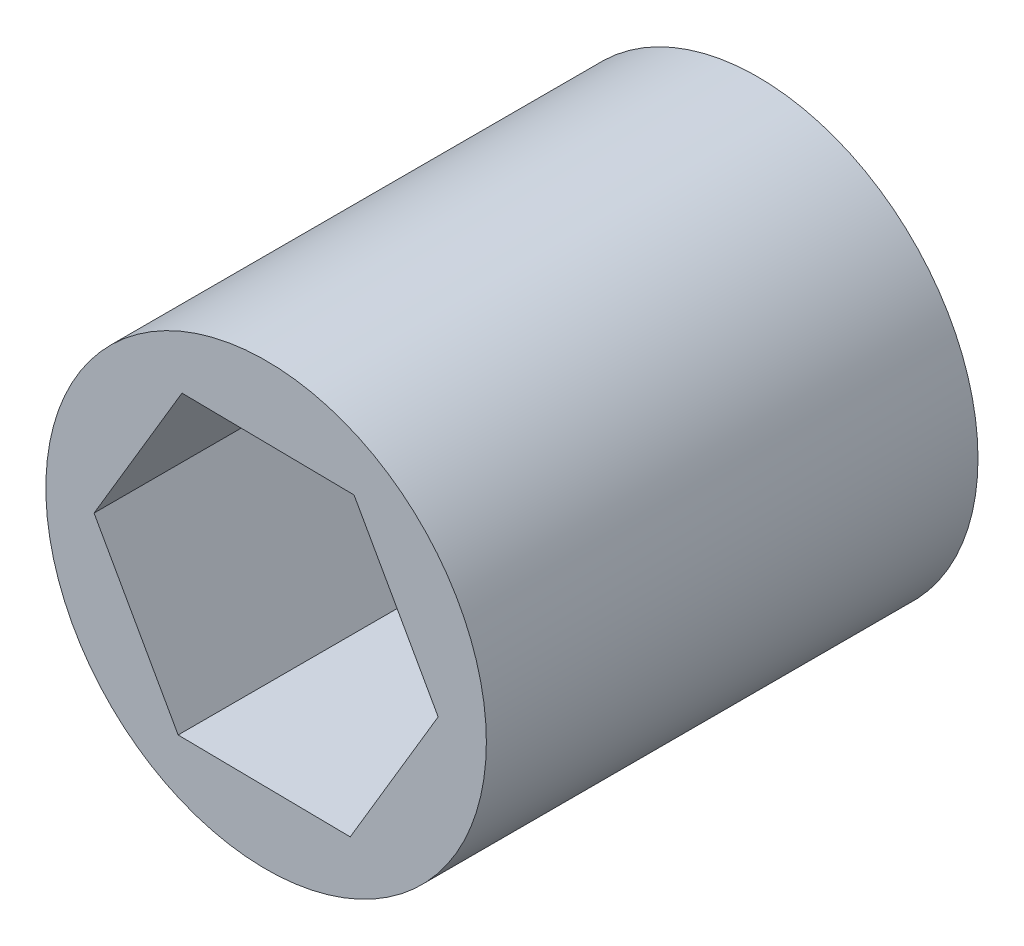
ISO-10303-21;
HEADER;
FILE_DESCRIPTION(('STEP AP214'),'2;1');
FILE_NAME('part.step','',(''),(''),'','','');
FILE_SCHEMA(('AUTOMOTIVE_DESIGN { 1 0 10303 214 1 1 1 1 }'));
ENDSEC;
DATA;
#1=APPLICATION_CONTEXT('core data for automotive mechanical design processes');
#2=APPLICATION_PROTOCOL_DEFINITION('international standard','automotive_design',2000,#1);
#3=PRODUCT_CONTEXT('',#1,'mechanical');
#4=PRODUCT('Part','Part','',(#3));
#5=PRODUCT_RELATED_PRODUCT_CATEGORY('part','',(#4));
#6=PRODUCT_DEFINITION_FORMATION('','',#4);
#7=PRODUCT_DEFINITION_CONTEXT('part definition',#1,'design');
#8=PRODUCT_DEFINITION('design','',#6,#7);
#9=PRODUCT_DEFINITION_SHAPE('','',#8);
#10=(LENGTH_UNIT() NAMED_UNIT(*) SI_UNIT(.MILLI.,.METRE.));
#11=(NAMED_UNIT(*) PLANE_ANGLE_UNIT() SI_UNIT($,.RADIAN.));
#12=(NAMED_UNIT(*) SI_UNIT($,.STERADIAN.) SOLID_ANGLE_UNIT());
#13=UNCERTAINTY_MEASURE_WITH_UNIT(LENGTH_MEASURE(1.E-05),#10,'distance_accuracy_value','');
#14=(GEOMETRIC_REPRESENTATION_CONTEXT(3) GLOBAL_UNCERTAINTY_ASSIGNED_CONTEXT((#13)) GLOBAL_UNIT_ASSIGNED_CONTEXT((#10,
#11,#12)) REPRESENTATION_CONTEXT('',''));
#15=CARTESIAN_POINT('',(0.,0.,0.));
#16=DIRECTION('',(0.,0.,1.));
#17=DIRECTION('',(1.,0.,0.));
#18=AXIS2_PLACEMENT_3D('',#15,#16,#17);
#19=CARTESIAN_POINT('',(0.,0.,20.));
#20=DIRECTION('',(0.,0.,1.));
#21=DIRECTION('',(1.,0.,0.));
#22=AXIS2_PLACEMENT_3D('',#19,#20,#21);
#23=PLANE('',#22);
#24=CARTESIAN_POINT('',(0.,0.,20.));
#25=DIRECTION('',(0.,0.,1.));
#26=DIRECTION('',(1.,0.,0.));
#27=AXIS2_PLACEMENT_3D('',#24,#25,#26);
#28=CIRCLE('',#27,8.9605185633105);
#29=CARTESIAN_POINT('',(8.9605185633105,0.,20.));
#30=VERTEX_POINT('',#29);
#31=EDGE_CURVE('E11',#30,#30,#28,.T.);
#32=ORIENTED_EDGE('',*,*,#31,.T.);
#33=EDGE_LOOP('',(#32));
#34=FACE_BOUND('',#33,.T.);
#35=DIRECTION('',(-0.511096833320989,-0.859523139286696,0.));
#36=VECTOR('',#35,1.);
#37=CARTESIAN_POINT('',(-3.42174319971634,6.10669087765174,20.));
#38=LINE('',#37,#36);
#39=CARTESIAN_POINT('',(-3.42174319971634,6.10669087765174,20.));
#40=VERTEX_POINT('',#39);
#41=CARTESIAN_POINT('',(-6.99942103296326,0.0900289026448678,20.));
#42=VERTEX_POINT('',#41);
#43=EDGE_CURVE('E102',#40,#42,#38,.T.);
#44=ORIENTED_EDGE('',*,*,#43,.F.);
#45=DIRECTION('',(-0.999917290423324,0.0128612718064094,0.));
#46=VECTOR('',#45,1.);
#47=CARTESIAN_POINT('',(3.57767783324692,6.01666197500687,20.));
#48=LINE('',#47,#46);
#49=CARTESIAN_POINT('',(3.57767783324692,6.01666197500687,20.));
#50=VERTEX_POINT('',#49);
#51=EDGE_CURVE('E93',#50,#40,#48,.T.);
#52=ORIENTED_EDGE('',*,*,#51,.F.);
#53=DIRECTION('',(-0.488820457102335,0.872384411093105,0.));
#54=VECTOR('',#53,1.);
#55=CARTESIAN_POINT('',(6.99942103296326,-0.0900289026448618,20.));
#56=LINE('',#55,#54);
#57=CARTESIAN_POINT('',(6.99942103296327,-0.0900289026448623,20.));
#58=VERTEX_POINT('',#57);
#59=EDGE_CURVE('E127',#58,#50,#56,.T.);
#60=ORIENTED_EDGE('',*,*,#59,.F.);
#61=DIRECTION('',(0.511096833320989,0.859523139286696,0.));
#62=VECTOR('',#61,1.);
#63=CARTESIAN_POINT('',(3.42174319971634,-6.10669087765173,20.));
#64=LINE('',#63,#62);
#65=CARTESIAN_POINT('',(3.42174319971634,-6.10669087765173,20.));
#66=VERTEX_POINT('',#65);
#67=EDGE_CURVE('E124',#66,#58,#64,.T.);
#68=ORIENTED_EDGE('',*,*,#67,.F.);
#69=DIRECTION('',(0.999917290423324,-0.0128612718064088,0.));
#70=VECTOR('',#69,1.);
#71=CARTESIAN_POINT('',(-3.57767783324692,-6.01666197500687,20.));
#72=LINE('',#71,#70);
#73=CARTESIAN_POINT('',(-3.57767783324692,-6.01666197500687,20.));
#74=VERTEX_POINT('',#73);
#75=EDGE_CURVE('E119',#74,#66,#72,.T.);
#76=ORIENTED_EDGE('',*,*,#75,.F.);
#77=DIRECTION('',(0.488820457102335,-0.872384411093105,0.));
#78=VECTOR('',#77,1.);
#79=CARTESIAN_POINT('',(-6.99942103296326,0.0900289026448678,20.));
#80=LINE('',#79,#78);
#81=EDGE_CURVE('E115',#42,#74,#80,.T.);
#82=ORIENTED_EDGE('',*,*,#81,.F.);
#83=EDGE_LOOP('',(#44,#52,#60,#68,#76,#82));
#84=FACE_BOUND('',#83,.T.);
#85=ADVANCED_FACE('F39',(#34,#84),#23,.T.);
#86=CARTESIAN_POINT('',(0.,0.,0.));
#87=DIRECTION('',(0.,0.,1.));
#88=DIRECTION('',(1.,0.,0.));
#89=AXIS2_PLACEMENT_3D('',#86,#87,#88);
#90=PLANE('',#89);
#91=CARTESIAN_POINT('',(0.,0.,0.));
#92=DIRECTION('',(0.,0.,1.));
#93=DIRECTION('',(1.,0.,0.));
#94=AXIS2_PLACEMENT_3D('',#91,#92,#93);
#95=CIRCLE('',#94,8.9605185633105);
#96=CARTESIAN_POINT('',(8.9605185633105,0.,0.));
#97=VERTEX_POINT('',#96);
#98=EDGE_CURVE('E43',#97,#97,#95,.T.);
#99=ORIENTED_EDGE('',*,*,#98,.F.);
#100=EDGE_LOOP('',(#99));
#101=FACE_BOUND('',#100,.T.);
#102=DIRECTION('',(-0.999917290423324,0.0128612718064094,0.));
#103=VECTOR('',#102,1.);
#104=CARTESIAN_POINT('',(3.57767783324692,6.01666197500687,0.));
#105=LINE('',#104,#103);
#106=CARTESIAN_POINT('',(3.57767783324692,6.01666197500687,0.));
#107=VERTEX_POINT('',#106);
#108=CARTESIAN_POINT('',(-3.42174319971634,6.10669087765174,0.));
#109=VERTEX_POINT('',#108);
#110=EDGE_CURVE('E63',#107,#109,#105,.T.);
#111=ORIENTED_EDGE('',*,*,#110,.T.);
#112=DIRECTION('',(-0.511096833320989,-0.859523139286696,0.));
#113=VECTOR('',#112,1.);
#114=CARTESIAN_POINT('',(-3.42174319971634,6.10669087765174,0.));
#115=LINE('',#114,#113);
#116=CARTESIAN_POINT('',(-6.99942103296326,0.0900289026448678,0.));
#117=VERTEX_POINT('',#116);
#118=EDGE_CURVE('E109',#109,#117,#115,.T.);
#119=ORIENTED_EDGE('',*,*,#118,.T.);
#120=DIRECTION('',(0.488820457102335,-0.872384411093105,0.));
#121=VECTOR('',#120,1.);
#122=CARTESIAN_POINT('',(-6.99942103296326,0.0900289026448678,0.));
#123=LINE('',#122,#121);
#124=CARTESIAN_POINT('',(-3.57767783324692,-6.01666197500687,0.));
#125=VERTEX_POINT('',#124);
#126=EDGE_CURVE('E134',#117,#125,#123,.T.);
#127=ORIENTED_EDGE('',*,*,#126,.T.);
#128=DIRECTION('',(0.999917290423324,-0.0128612718064088,0.));
#129=VECTOR('',#128,1.);
#130=CARTESIAN_POINT('',(-3.57767783324692,-6.01666197500687,0.));
#131=LINE('',#130,#129);
#132=CARTESIAN_POINT('',(3.42174319971634,-6.10669087765173,0.));
#133=VERTEX_POINT('',#132);
#134=EDGE_CURVE('E138',#125,#133,#131,.T.);
#135=ORIENTED_EDGE('',*,*,#134,.T.);
#136=DIRECTION('',(0.511096833320989,0.859523139286696,0.));
#137=VECTOR('',#136,1.);
#138=CARTESIAN_POINT('',(3.42174319971634,-6.10669087765173,0.));
#139=LINE('',#138,#137);
#140=CARTESIAN_POINT('',(6.99942103296326,-0.0900289026448618,0.));
#141=VERTEX_POINT('',#140);
#142=EDGE_CURVE('E142',#133,#141,#139,.T.);
#143=ORIENTED_EDGE('',*,*,#142,.T.);
#144=DIRECTION('',(-0.488820457102335,0.872384411093105,0.));
#145=VECTOR('',#144,1.);
#146=CARTESIAN_POINT('',(6.99942103296326,-0.0900289026448618,0.));
#147=LINE('',#146,#145);
#148=EDGE_CURVE('E103',#141,#107,#147,.T.);
#149=ORIENTED_EDGE('',*,*,#148,.T.);
#150=EDGE_LOOP('',(#111,#119,#127,#135,#143,#149));
#151=FACE_BOUND('',#150,.T.);
#152=ADVANCED_FACE('F166',(#101,#151),#90,.F.);
#153=CARTESIAN_POINT('',(0.,0.,20.));
#154=DIRECTION('',(0.,0.,-1.));
#155=DIRECTION('',(-1.,0.,0.));
#156=AXIS2_PLACEMENT_3D('',#153,#154,#155);
#157=CYLINDRICAL_SURFACE('',#156,8.9605185633105);
#158=ORIENTED_EDGE('',*,*,#31,.F.);
#159=EDGE_LOOP('',(#158));
#160=FACE_BOUND('',#159,.T.);
#161=ORIENTED_EDGE('',*,*,#98,.T.);
#162=EDGE_LOOP('',(#161));
#163=FACE_BOUND('',#162,.T.);
#164=ADVANCED_FACE('F41',(#160,#163),#157,.T.);
#165=CARTESIAN_POINT('',(3.57767783324692,6.01666197500687,20.));
#166=DIRECTION('',(-0.0128612718064094,-0.999917290423324,0.));
#167=DIRECTION('',(0.999917290423324,-0.0128612718064094,0.));
#168=AXIS2_PLACEMENT_3D('',#165,#166,#167);
#169=PLANE('',#168);
#170=ORIENTED_EDGE('',*,*,#110,.F.);
#171=DIRECTION('',(0.,0.,-1.));
#172=VECTOR('',#171,1.);
#173=CARTESIAN_POINT('',(3.57767783324692,6.01666197500687,20.));
#174=LINE('',#173,#172);
#175=EDGE_CURVE('E97',#50,#107,#174,.T.);
#176=ORIENTED_EDGE('',*,*,#175,.F.);
#177=ORIENTED_EDGE('',*,*,#51,.T.);
#178=DIRECTION('',(0.,0.,-1.));
#179=VECTOR('',#178,1.);
#180=CARTESIAN_POINT('',(-3.42174319971634,6.10669087765174,20.));
#181=LINE('',#180,#179);
#182=EDGE_CURVE('E96',#40,#109,#181,.T.);
#183=ORIENTED_EDGE('',*,*,#182,.T.);
#184=EDGE_LOOP('',(#170,#176,#177,#183));
#185=FACE_BOUND('',#184,.T.);
#186=ADVANCED_FACE('F95',(#185),#169,.T.);
#187=CARTESIAN_POINT('',(-3.42174319971634,6.10669087765174,20.));
#188=DIRECTION('',(0.859523139286696,-0.511096833320989,0.));
#189=DIRECTION('',(0.511096833320989,0.859523139286696,0.));
#190=AXIS2_PLACEMENT_3D('',#187,#188,#189);
#191=PLANE('',#190);
#192=ORIENTED_EDGE('',*,*,#118,.F.);
#193=ORIENTED_EDGE('',*,*,#182,.F.);
#194=ORIENTED_EDGE('',*,*,#43,.T.);
#195=DIRECTION('',(0.,0.,-1.));
#196=VECTOR('',#195,1.);
#197=CARTESIAN_POINT('',(-6.99942103296326,0.0900289026448678,20.));
#198=LINE('',#197,#196);
#199=EDGE_CURVE('E111',#42,#117,#198,.T.);
#200=ORIENTED_EDGE('',*,*,#199,.T.);
#201=EDGE_LOOP('',(#192,#193,#194,#200));
#202=FACE_BOUND('',#201,.T.);
#203=ADVANCED_FACE('F106',(#202),#191,.T.);
#204=CARTESIAN_POINT('',(-6.99942103296326,0.0900289026448678,20.));
#205=DIRECTION('',(0.872384411093105,0.488820457102335,0.));
#206=DIRECTION('',(-0.488820457102335,0.872384411093105,0.));
#207=AXIS2_PLACEMENT_3D('',#204,#205,#206);
#208=PLANE('',#207);
#209=ORIENTED_EDGE('',*,*,#126,.F.);
#210=ORIENTED_EDGE('',*,*,#199,.F.);
#211=ORIENTED_EDGE('',*,*,#81,.T.);
#212=DIRECTION('',(0.,0.,-1.));
#213=VECTOR('',#212,1.);
#214=CARTESIAN_POINT('',(-3.57767783324692,-6.01666197500687,20.));
#215=LINE('',#214,#213);
#216=EDGE_CURVE('E156',#74,#125,#215,.T.);
#217=ORIENTED_EDGE('',*,*,#216,.T.);
#218=EDGE_LOOP('',(#209,#210,#211,#217));
#219=FACE_BOUND('',#218,.T.);
#220=ADVANCED_FACE('F162',(#219),#208,.T.);
#221=CARTESIAN_POINT('',(-3.57767783324692,-6.01666197500687,20.));
#222=DIRECTION('',(0.0128612718064088,0.999917290423324,0.));
#223=DIRECTION('',(-0.999917290423324,0.0128612718064088,0.));
#224=AXIS2_PLACEMENT_3D('',#221,#222,#223);
#225=PLANE('',#224);
#226=ORIENTED_EDGE('',*,*,#134,.F.);
#227=ORIENTED_EDGE('',*,*,#216,.F.);
#228=ORIENTED_EDGE('',*,*,#75,.T.);
#229=DIRECTION('',(0.,0.,-1.));
#230=VECTOR('',#229,1.);
#231=CARTESIAN_POINT('',(3.42174319971634,-6.10669087765173,20.));
#232=LINE('',#231,#230);
#233=EDGE_CURVE('E153',#66,#133,#232,.T.);
#234=ORIENTED_EDGE('',*,*,#233,.T.);
#235=EDGE_LOOP('',(#226,#227,#228,#234));
#236=FACE_BOUND('',#235,.T.);
#237=ADVANCED_FACE('F174',(#236),#225,.T.);
#238=CARTESIAN_POINT('',(3.42174319971634,-6.10669087765173,20.));
#239=DIRECTION('',(-0.859523139286696,0.511096833320989,0.));
#240=DIRECTION('',(-0.511096833320989,-0.859523139286696,0.));
#241=AXIS2_PLACEMENT_3D('',#238,#239,#240);
#242=PLANE('',#241);
#243=ORIENTED_EDGE('',*,*,#142,.F.);
#244=ORIENTED_EDGE('',*,*,#233,.F.);
#245=ORIENTED_EDGE('',*,*,#67,.T.);
#246=DIRECTION('',(0.,0.,-1.));
#247=VECTOR('',#246,1.);
#248=CARTESIAN_POINT('',(6.99942103296326,-0.0900289026448618,20.));
#249=LINE('',#248,#247);
#250=EDGE_CURVE('E55',#58,#141,#249,.T.);
#251=ORIENTED_EDGE('',*,*,#250,.T.);
#252=EDGE_LOOP('',(#243,#244,#245,#251));
#253=FACE_BOUND('',#252,.T.);
#254=ADVANCED_FACE('F172',(#253),#242,.T.);
#255=CARTESIAN_POINT('',(6.99942103296326,-0.0900289026448618,20.));
#256=DIRECTION('',(-0.872384411093105,-0.488820457102335,0.));
#257=DIRECTION('',(0.488820457102335,-0.872384411093105,0.));
#258=AXIS2_PLACEMENT_3D('',#255,#256,#257);
#259=PLANE('',#258);
#260=ORIENTED_EDGE('',*,*,#148,.F.);
#261=ORIENTED_EDGE('',*,*,#250,.F.);
#262=ORIENTED_EDGE('',*,*,#59,.T.);
#263=ORIENTED_EDGE('',*,*,#175,.T.);
#264=EDGE_LOOP('',(#260,#261,#262,#263));
#265=FACE_BOUND('',#264,.T.);
#266=ADVANCED_FACE('F168',(#265),#259,.T.);
#267=CLOSED_SHELL('',(#85,#152,#164,#186,#203,#220,#237,#254,#266));
#268=MANIFOLD_SOLID_BREP('B2',#267);
#269=ADVANCED_BREP_SHAPE_REPRESENTATION('',(#18,#268),#14);
#270=SHAPE_DEFINITION_REPRESENTATION(#9,#269);
ENDSEC;
END-ISO-10303-21;
